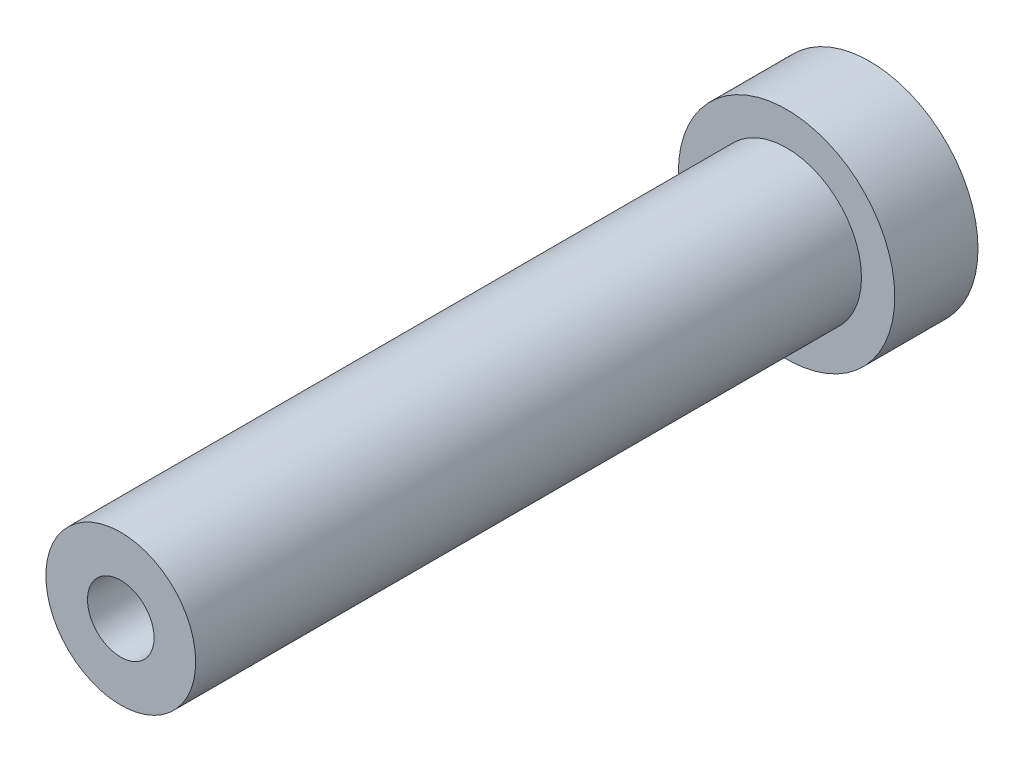
ISO-10303-21;
HEADER;
FILE_DESCRIPTION(('STEP AP214'),'2;1');
FILE_NAME('part.step','',(''),(''),'','','');
FILE_SCHEMA(('AUTOMOTIVE_DESIGN { 1 0 10303 214 1 1 1 1 }'));
ENDSEC;
DATA;
#1=APPLICATION_CONTEXT('core data for automotive mechanical design processes');
#2=APPLICATION_PROTOCOL_DEFINITION('international standard','automotive_design',2000,#1);
#3=PRODUCT_CONTEXT('',#1,'mechanical');
#4=PRODUCT('Part','Part','',(#3));
#5=PRODUCT_RELATED_PRODUCT_CATEGORY('part','',(#4));
#6=PRODUCT_DEFINITION_FORMATION('','',#4);
#7=PRODUCT_DEFINITION_CONTEXT('part definition',#1,'design');
#8=PRODUCT_DEFINITION('design','',#6,#7);
#9=PRODUCT_DEFINITION_SHAPE('','',#8);
#10=(LENGTH_UNIT() NAMED_UNIT(*) SI_UNIT(.MILLI.,.METRE.));
#11=(NAMED_UNIT(*) PLANE_ANGLE_UNIT() SI_UNIT($,.RADIAN.));
#12=(NAMED_UNIT(*) SI_UNIT($,.STERADIAN.) SOLID_ANGLE_UNIT());
#13=UNCERTAINTY_MEASURE_WITH_UNIT(LENGTH_MEASURE(1.E-05),#10,'distance_accuracy_value','');
#14=(GEOMETRIC_REPRESENTATION_CONTEXT(3) GLOBAL_UNCERTAINTY_ASSIGNED_CONTEXT((#13)) GLOBAL_UNIT_ASSIGNED_CONTEXT((#10,
#11,#12)) REPRESENTATION_CONTEXT('',''));
#15=CARTESIAN_POINT('',(0.,0.,0.));
#16=DIRECTION('',(0.,0.,1.));
#17=DIRECTION('',(1.,0.,0.));
#18=AXIS2_PLACEMENT_3D('',#15,#16,#17);
#19=CARTESIAN_POINT('',(0.,0.,40.));
#20=DIRECTION('',(0.,0.,1.));
#21=DIRECTION('',(1.,0.,0.));
#22=AXIS2_PLACEMENT_3D('',#19,#20,#21);
#23=PLANE('',#22);
#24=CARTESIAN_POINT('',(0.,0.,40.));
#25=DIRECTION('',(0.,0.,1.));
#26=DIRECTION('',(1.,0.,0.));
#27=AXIS2_PLACEMENT_3D('',#24,#25,#26);
#28=CIRCLE('',#27,4.5);
#29=CARTESIAN_POINT('',(4.5,0.,40.));
#30=VERTEX_POINT('',#29);
#31=EDGE_CURVE('E10',#30,#30,#28,.T.);
#32=ORIENTED_EDGE('',*,*,#31,.T.);
#33=EDGE_LOOP('',(#32));
#34=FACE_BOUND('',#33,.T.);
#35=CARTESIAN_POINT('',(0.,0.,40.));
#36=DIRECTION('',(0.,0.,1.));
#37=DIRECTION('',(1.,0.,0.));
#38=AXIS2_PLACEMENT_3D('',#35,#36,#37);
#39=CIRCLE('',#38,2.);
#40=CARTESIAN_POINT('',(2.,0.,40.));
#41=VERTEX_POINT('',#40);
#42=EDGE_CURVE('E46',#41,#41,#39,.T.);
#43=ORIENTED_EDGE('',*,*,#42,.F.);
#44=EDGE_LOOP('',(#43));
#45=FACE_BOUND('',#44,.T.);
#46=ADVANCED_FACE('F37',(#34,#45),#23,.T.);
#47=CARTESIAN_POINT('',(0.,0.,40.));
#48=DIRECTION('',(0.,0.,-1.));
#49=DIRECTION('',(-1.,0.,0.));
#50=AXIS2_PLACEMENT_3D('',#47,#48,#49);
#51=CYLINDRICAL_SURFACE('',#50,4.5);
#52=ORIENTED_EDGE('',*,*,#31,.F.);
#53=EDGE_LOOP('',(#52));
#54=FACE_BOUND('',#53,.T.);
#55=CARTESIAN_POINT('',(0.,0.,0.));
#56=DIRECTION('',(0.,0.,1.));
#57=DIRECTION('',(1.,0.,0.));
#58=AXIS2_PLACEMENT_3D('',#55,#56,#57);
#59=CIRCLE('',#58,4.5);
#60=CARTESIAN_POINT('',(4.5,0.,0.));
#61=VERTEX_POINT('',#60);
#62=EDGE_CURVE('E41',#61,#61,#59,.T.);
#63=ORIENTED_EDGE('',*,*,#62,.T.);
#64=EDGE_LOOP('',(#63));
#65=FACE_BOUND('',#64,.T.);
#66=ADVANCED_FACE('F39',(#54,#65),#51,.T.);
#67=CARTESIAN_POINT('',(0.,0.,40.));
#68=DIRECTION('',(0.,0.,-1.));
#69=DIRECTION('',(-1.,0.,0.));
#70=AXIS2_PLACEMENT_3D('',#67,#68,#69);
#71=CYLINDRICAL_SURFACE('',#70,2.);
#72=ORIENTED_EDGE('',*,*,#42,.T.);
#73=EDGE_LOOP('',(#72));
#74=FACE_BOUND('',#73,.T.);
#75=CARTESIAN_POINT('',(0.,0.,0.));
#76=DIRECTION('',(0.,0.,1.));
#77=DIRECTION('',(1.,0.,0.));
#78=AXIS2_PLACEMENT_3D('',#75,#76,#77);
#79=CIRCLE('',#78,2.);
#80=CARTESIAN_POINT('',(2.,0.,0.));
#81=VERTEX_POINT('',#80);
#82=EDGE_CURVE('E51',#81,#81,#79,.T.);
#83=ORIENTED_EDGE('',*,*,#82,.F.);
#84=EDGE_LOOP('',(#83));
#85=FACE_BOUND('',#84,.T.);
#86=ADVANCED_FACE('F88',(#74,#85),#71,.F.);
#87=CARTESIAN_POINT('',(0.,0.,0.));
#88=DIRECTION('',(0.,0.,-1.));
#89=DIRECTION('',(-1.,0.,0.));
#90=AXIS2_PLACEMENT_3D('',#87,#88,#89);
#91=PLANE('',#90);
#92=ORIENTED_EDGE('',*,*,#82,.T.);
#93=EDGE_LOOP('',(#92));
#94=FACE_BOUND('',#93,.T.);
#95=ADVANCED_FACE('F76',(#94),#91,.F.);
#96=CARTESIAN_POINT('',(0.,0.,-5.));
#97=DIRECTION('',(0.,0.,1.));
#98=DIRECTION('',(1.,0.,0.));
#99=AXIS2_PLACEMENT_3D('',#96,#97,#98);
#100=CYLINDRICAL_SURFACE('',#99,6.5);
#101=CARTESIAN_POINT('',(0.,0.,-5.));
#102=DIRECTION('',(0.,0.,-1.));
#103=DIRECTION('',(-1.,0.,0.));
#104=AXIS2_PLACEMENT_3D('',#101,#102,#103);
#105=CIRCLE('',#104,6.5);
#106=CARTESIAN_POINT('',(-6.5,0.,-5.));
#107=VERTEX_POINT('',#106);
#108=EDGE_CURVE('E61',#107,#107,#105,.T.);
#109=ORIENTED_EDGE('',*,*,#108,.F.);
#110=EDGE_LOOP('',(#109));
#111=FACE_BOUND('',#110,.T.);
#112=CARTESIAN_POINT('',(0.,0.,0.));
#113=DIRECTION('',(0.,0.,-1.));
#114=DIRECTION('',(-1.,0.,0.));
#115=AXIS2_PLACEMENT_3D('',#112,#113,#114);
#116=CIRCLE('',#115,6.5);
#117=CARTESIAN_POINT('',(-6.5,0.,0.));
#118=VERTEX_POINT('',#117);
#119=EDGE_CURVE('E57',#118,#118,#116,.T.);
#120=ORIENTED_EDGE('',*,*,#119,.T.);
#121=EDGE_LOOP('',(#120));
#122=FACE_BOUND('',#121,.T.);
#123=ADVANCED_FACE('F79',(#111,#122),#100,.T.);
#124=CARTESIAN_POINT('',(0.,0.,-5.));
#125=DIRECTION('',(0.,0.,-1.));
#126=DIRECTION('',(-1.,0.,0.));
#127=AXIS2_PLACEMENT_3D('',#124,#125,#126);
#128=PLANE('',#127);
#129=ORIENTED_EDGE('',*,*,#108,.T.);
#130=EDGE_LOOP('',(#129));
#131=FACE_BOUND('',#130,.T.);
#132=ADVANCED_FACE('F74',(#131),#128,.T.);
#133=ORIENTED_EDGE('',*,*,#62,.F.);
#134=EDGE_LOOP('',(#133));
#135=FACE_BOUND('',#134,.T.);
#136=ORIENTED_EDGE('',*,*,#119,.F.);
#137=EDGE_LOOP('',(#136));
#138=FACE_BOUND('',#137,.T.);
#139=ADVANCED_FACE('F71',(#135,#138),#91,.F.);
#140=CLOSED_SHELL('',(#46,#66,#86,#95,#123,#132,#139));
#141=MANIFOLD_SOLID_BREP('B2',#140);
#142=ADVANCED_BREP_SHAPE_REPRESENTATION('',(#18,#141),#14);
#143=SHAPE_DEFINITION_REPRESENTATION(#9,#142);
ENDSEC;
END-ISO-10303-21;
